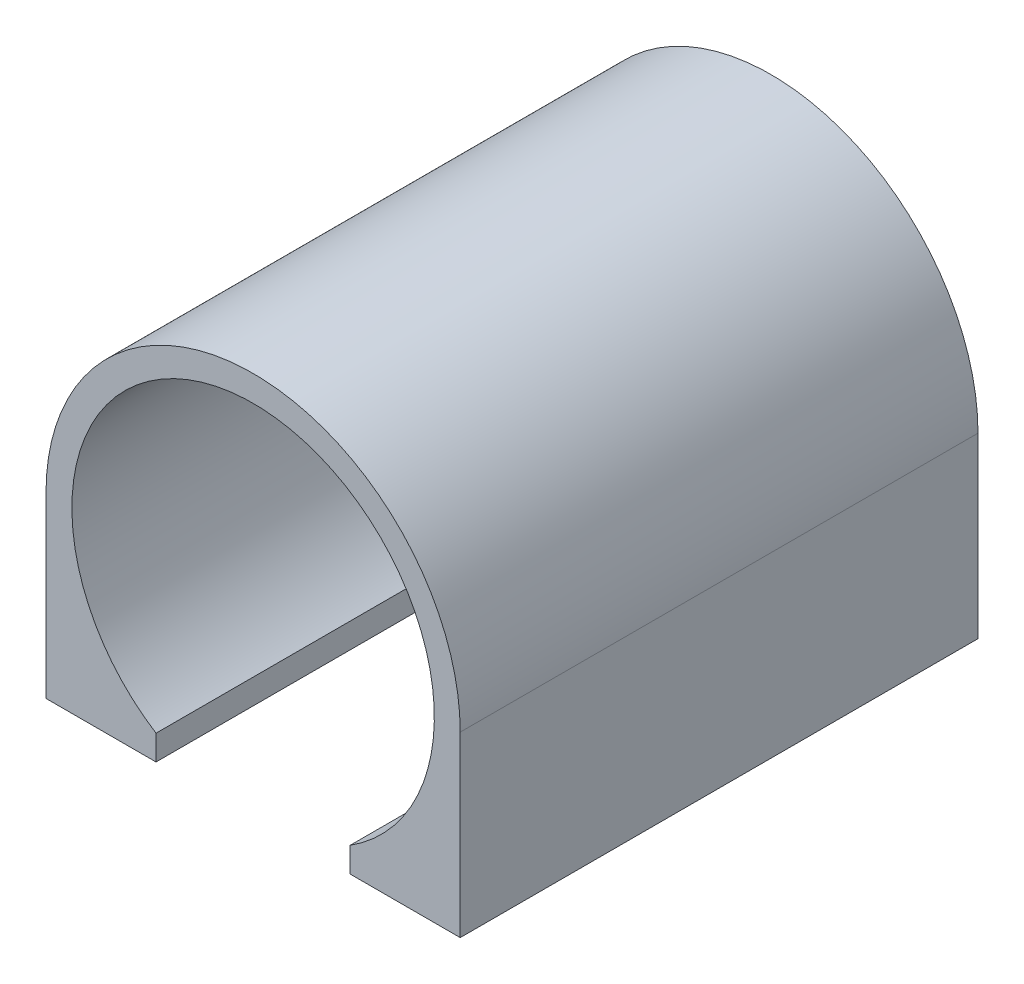
ISO-10303-21;
HEADER;
FILE_DESCRIPTION(('STEP AP214'),'2;1');
FILE_NAME('part.step','',(''),(''),'','','');
FILE_SCHEMA(('AUTOMOTIVE_DESIGN { 1 0 10303 214 1 1 1 1 }'));
ENDSEC;
DATA;
#1=APPLICATION_CONTEXT('core data for automotive mechanical design processes');
#2=APPLICATION_PROTOCOL_DEFINITION('international standard','automotive_design',2000,#1);
#3=PRODUCT_CONTEXT('',#1,'mechanical');
#4=PRODUCT('Part','Part','',(#3));
#5=PRODUCT_RELATED_PRODUCT_CATEGORY('part','',(#4));
#6=PRODUCT_DEFINITION_FORMATION('','',#4);
#7=PRODUCT_DEFINITION_CONTEXT('part definition',#1,'design');
#8=PRODUCT_DEFINITION('design','',#6,#7);
#9=PRODUCT_DEFINITION_SHAPE('','',#8);
#10=(LENGTH_UNIT() NAMED_UNIT(*) SI_UNIT(.MILLI.,.METRE.));
#11=(NAMED_UNIT(*) PLANE_ANGLE_UNIT() SI_UNIT($,.RADIAN.));
#12=(NAMED_UNIT(*) SI_UNIT($,.STERADIAN.) SOLID_ANGLE_UNIT());
#13=UNCERTAINTY_MEASURE_WITH_UNIT(LENGTH_MEASURE(1.E-05),#10,'distance_accuracy_value','');
#14=(GEOMETRIC_REPRESENTATION_CONTEXT(3) GLOBAL_UNCERTAINTY_ASSIGNED_CONTEXT((#13)) GLOBAL_UNIT_ASSIGNED_CONTEXT((#10,
#11,#12)) REPRESENTATION_CONTEXT('',''));
#15=CARTESIAN_POINT('',(0.,0.,0.));
#16=DIRECTION('',(0.,0.,1.));
#17=DIRECTION('',(1.,0.,0.));
#18=AXIS2_PLACEMENT_3D('',#15,#16,#17);
#19=CARTESIAN_POINT('',(0.,-13.75,40.));
#20=DIRECTION('',(0.,-1.,0.));
#21=DIRECTION('',(1.,0.,0.));
#22=AXIS2_PLACEMENT_3D('',#19,#20,#21);
#23=PLANE('',#22);
#24=CARTESIAN_POINT('',(-13.,-13.75,33.3333333333333));
#25=DIRECTION('',(0.,-1.,0.));
#26=DIRECTION('',(-1.,0.,0.));
#27=AXIS2_PLACEMENT_3D('',#24,#25,#26);
#28=CIRCLE('',#27,1.5);
#29=CARTESIAN_POINT('',(-14.5,-13.75,33.3333333333333));
#30=VERTEX_POINT('',#29);
#31=EDGE_CURVE('E220',#30,#30,#28,.T.);
#32=ORIENTED_EDGE('',*,*,#31,.F.);
#33=EDGE_LOOP('',(#32));
#34=FACE_BOUND('',#33,.T.);
#35=CARTESIAN_POINT('',(-13.,-13.75,20.));
#36=DIRECTION('',(0.,-1.,0.));
#37=DIRECTION('',(-1.,0.,0.));
#38=AXIS2_PLACEMENT_3D('',#35,#36,#37);
#39=CIRCLE('',#38,1.5);
#40=CARTESIAN_POINT('',(-14.5,-13.75,20.));
#41=VERTEX_POINT('',#40);
#42=EDGE_CURVE('E211',#41,#41,#39,.T.);
#43=ORIENTED_EDGE('',*,*,#42,.F.);
#44=EDGE_LOOP('',(#43));
#45=FACE_BOUND('',#44,.T.);
#46=CARTESIAN_POINT('',(-13.,-13.75,6.66666666666667));
#47=DIRECTION('',(0.,-1.,0.));
#48=DIRECTION('',(-1.,0.,0.));
#49=AXIS2_PLACEMENT_3D('',#46,#47,#48);
#50=CIRCLE('',#49,1.5);
#51=CARTESIAN_POINT('',(-14.5,-13.75,6.66666666666667));
#52=VERTEX_POINT('',#51);
#53=EDGE_CURVE('E202',#52,#52,#50,.T.);
#54=ORIENTED_EDGE('',*,*,#53,.F.);
#55=EDGE_LOOP('',(#54));
#56=FACE_BOUND('',#55,.T.);
#57=DIRECTION('',(-1.,0.,0.));
#58=VECTOR('',#57,1.);
#59=CARTESIAN_POINT('',(0.,-13.75,0.));
#60=LINE('',#59,#58);
#61=CARTESIAN_POINT('',(-7.5,-13.75,0.));
#62=VERTEX_POINT('',#61);
#63=CARTESIAN_POINT('',(-16.,-13.75,0.));
#64=VERTEX_POINT('',#63);
#65=EDGE_CURVE('E131',#62,#64,#60,.T.);
#66=ORIENTED_EDGE('',*,*,#65,.F.);
#67=DIRECTION('',(0.,0.,1.));
#68=VECTOR('',#67,1.);
#69=CARTESIAN_POINT('',(-7.5,-13.75,0.));
#70=LINE('',#69,#68);
#71=CARTESIAN_POINT('',(-7.5,-13.75,40.));
#72=VERTEX_POINT('',#71);
#73=EDGE_CURVE('E60',#62,#72,#70,.T.);
#74=ORIENTED_EDGE('',*,*,#73,.T.);
#75=DIRECTION('',(-1.,0.,0.));
#76=VECTOR('',#75,1.);
#77=CARTESIAN_POINT('',(0.,-13.75,40.));
#78=LINE('',#77,#76);
#79=CARTESIAN_POINT('',(-16.,-13.75,40.));
#80=VERTEX_POINT('',#79);
#81=EDGE_CURVE('E164',#72,#80,#78,.T.);
#82=ORIENTED_EDGE('',*,*,#81,.T.);
#83=DIRECTION('',(0.,0.,-1.));
#84=VECTOR('',#83,1.);
#85=CARTESIAN_POINT('',(-16.,-13.75,40.));
#86=LINE('',#85,#84);
#87=EDGE_CURVE('E140',#80,#64,#86,.T.);
#88=ORIENTED_EDGE('',*,*,#87,.T.);
#89=EDGE_LOOP('',(#66,#74,#82,#88));
#90=FACE_BOUND('',#89,.T.);
#91=ADVANCED_FACE('F45',(#34,#45,#56,#90),#23,.T.);
#92=CARTESIAN_POINT('',(0.,0.,40.));
#93=DIRECTION('',(0.,0.,-1.));
#94=DIRECTION('',(-1.,0.,0.));
#95=AXIS2_PLACEMENT_3D('',#92,#93,#94);
#96=CYLINDRICAL_SURFACE('',#95,14.);
#97=CARTESIAN_POINT('',(0.,0.,40.));
#98=DIRECTION('',(0.,0.,1.));
#99=DIRECTION('',(1.,0.,0.));
#100=AXIS2_PLACEMENT_3D('',#97,#98,#99);
#101=CIRCLE('',#100,14.);
#102=CARTESIAN_POINT('',(7.5,-11.8215904175369,40.));
#103=VERTEX_POINT('',#102);
#104=CARTESIAN_POINT('',(-7.5,-11.8215904175369,40.));
#105=VERTEX_POINT('',#104);
#106=EDGE_CURVE('E172',#103,#105,#101,.T.);
#107=ORIENTED_EDGE('',*,*,#106,.T.);
#108=DIRECTION('',(0.,0.,-1.));
#109=VECTOR('',#108,1.);
#110=CARTESIAN_POINT('',(-7.5,-11.8215904175369,40.));
#111=LINE('',#110,#109);
#112=CARTESIAN_POINT('',(-7.5,-11.8215904175369,0.));
#113=VERTEX_POINT('',#112);
#114=EDGE_CURVE('E189',#105,#113,#111,.T.);
#115=ORIENTED_EDGE('',*,*,#114,.T.);
#116=CARTESIAN_POINT('',(0.,0.,0.));
#117=DIRECTION('',(0.,0.,1.));
#118=DIRECTION('',(1.,0.,0.));
#119=AXIS2_PLACEMENT_3D('',#116,#117,#118);
#120=CIRCLE('',#119,14.);
#121=CARTESIAN_POINT('',(7.5,-11.8215904175369,0.));
#122=VERTEX_POINT('',#121);
#123=EDGE_CURVE('E127',#122,#113,#120,.T.);
#124=ORIENTED_EDGE('',*,*,#123,.F.);
#125=DIRECTION('',(0.,0.,-1.));
#126=VECTOR('',#125,1.);
#127=CARTESIAN_POINT('',(7.5,-11.8215904175369,40.));
#128=LINE('',#127,#126);
#129=EDGE_CURVE('E63',#122,#103,#128,.F.);
#130=ORIENTED_EDGE('',*,*,#129,.T.);
#131=EDGE_LOOP('',(#107,#115,#124,#130));
#132=FACE_BOUND('',#131,.T.);
#133=ADVANCED_FACE('F228',(#132),#96,.F.);
#134=CARTESIAN_POINT('',(0.,-13.75,40.));
#135=DIRECTION('',(0.,1.,0.));
#136=DIRECTION('',(-1.,0.,0.));
#137=AXIS2_PLACEMENT_3D('',#134,#135,#136);
#138=PLANE('',#137);
#139=CARTESIAN_POINT('',(13.,-13.75,33.3333333333333));
#140=DIRECTION('',(0.,-1.,0.));
#141=DIRECTION('',(1.,0.,0.));
#142=AXIS2_PLACEMENT_3D('',#139,#140,#141);
#143=CIRCLE('',#142,1.5);
#144=CARTESIAN_POINT('',(14.5,-13.75,33.3333333333333));
#145=VERTEX_POINT('',#144);
#146=EDGE_CURVE('E156',#145,#145,#143,.T.);
#147=ORIENTED_EDGE('',*,*,#146,.F.);
#148=EDGE_LOOP('',(#147));
#149=FACE_BOUND('',#148,.T.);
#150=CARTESIAN_POINT('',(13.,-13.75,20.));
#151=DIRECTION('',(0.,-1.,0.));
#152=DIRECTION('',(1.,0.,0.));
#153=AXIS2_PLACEMENT_3D('',#150,#151,#152);
#154=CIRCLE('',#153,1.5);
#155=CARTESIAN_POINT('',(14.5,-13.75,20.));
#156=VERTEX_POINT('',#155);
#157=EDGE_CURVE('E194',#156,#156,#154,.T.);
#158=ORIENTED_EDGE('',*,*,#157,.F.);
#159=EDGE_LOOP('',(#158));
#160=FACE_BOUND('',#159,.T.);
#161=CARTESIAN_POINT('',(13.,-13.75,6.66666666666667));
#162=DIRECTION('',(0.,-1.,0.));
#163=DIRECTION('',(1.,0.,0.));
#164=AXIS2_PLACEMENT_3D('',#161,#162,#163);
#165=CIRCLE('',#164,1.5);
#166=CARTESIAN_POINT('',(14.5,-13.75,6.66666666666667));
#167=VERTEX_POINT('',#166);
#168=EDGE_CURVE('E200',#167,#167,#165,.T.);
#169=ORIENTED_EDGE('',*,*,#168,.F.);
#170=EDGE_LOOP('',(#169));
#171=FACE_BOUND('',#170,.T.);
#172=DIRECTION('',(0.,0.,1.));
#173=VECTOR('',#172,1.);
#174=CARTESIAN_POINT('',(7.5,-13.75,0.));
#175=LINE('',#174,#173);
#176=CARTESIAN_POINT('',(7.5,-13.75,0.));
#177=VERTEX_POINT('',#176);
#178=CARTESIAN_POINT('',(7.5,-13.75,40.));
#179=VERTEX_POINT('',#178);
#180=EDGE_CURVE('E104',#177,#179,#175,.T.);
#181=ORIENTED_EDGE('',*,*,#180,.F.);
#182=DIRECTION('',(1.,0.,0.));
#183=VECTOR('',#182,1.);
#184=CARTESIAN_POINT('',(0.,-13.75,0.));
#185=LINE('',#184,#183);
#186=CARTESIAN_POINT('',(16.,-13.75,0.));
#187=VERTEX_POINT('',#186);
#188=EDGE_CURVE('E113',#177,#187,#185,.T.);
#189=ORIENTED_EDGE('',*,*,#188,.T.);
#190=DIRECTION('',(0.,0.,-1.));
#191=VECTOR('',#190,1.);
#192=CARTESIAN_POINT('',(16.,-13.75,40.));
#193=LINE('',#192,#191);
#194=CARTESIAN_POINT('',(16.,-13.75,40.));
#195=VERTEX_POINT('',#194);
#196=EDGE_CURVE('E134',#195,#187,#193,.T.);
#197=ORIENTED_EDGE('',*,*,#196,.F.);
#198=DIRECTION('',(1.,0.,0.));
#199=VECTOR('',#198,1.);
#200=CARTESIAN_POINT('',(0.,-13.75,40.));
#201=LINE('',#200,#199);
#202=EDGE_CURVE('E120',#179,#195,#201,.T.);
#203=ORIENTED_EDGE('',*,*,#202,.F.);
#204=EDGE_LOOP('',(#181,#189,#197,#203));
#205=FACE_BOUND('',#204,.T.);
#206=ADVANCED_FACE('F114',(#149,#160,#171,#205),#138,.F.);
#207=CARTESIAN_POINT('',(0.,0.,40.));
#208=DIRECTION('',(0.,0.,1.));
#209=DIRECTION('',(1.,0.,0.));
#210=AXIS2_PLACEMENT_3D('',#207,#208,#209);
#211=PLANE('',#210);
#212=ORIENTED_EDGE('',*,*,#81,.F.);
#213=DIRECTION('',(0.,1.,0.));
#214=VECTOR('',#213,1.);
#215=CARTESIAN_POINT('',(-7.5,-13.75,40.));
#216=LINE('',#215,#214);
#217=EDGE_CURVE('E181',#72,#105,#216,.T.);
#218=ORIENTED_EDGE('',*,*,#217,.T.);
#219=ORIENTED_EDGE('',*,*,#106,.F.);
#220=DIRECTION('',(0.,-1.,0.));
#221=VECTOR('',#220,1.);
#222=CARTESIAN_POINT('',(7.5,-3.75,40.));
#223=LINE('',#222,#221);
#224=EDGE_CURVE('E182',#103,#179,#223,.T.);
#225=ORIENTED_EDGE('',*,*,#224,.T.);
#226=ORIENTED_EDGE('',*,*,#202,.T.);
#227=DIRECTION('',(0.,-1.,0.));
#228=VECTOR('',#227,1.);
#229=CARTESIAN_POINT('',(16.,0.,40.));
#230=LINE('',#229,#228);
#231=CARTESIAN_POINT('',(16.,0.,40.));
#232=VERTEX_POINT('',#231);
#233=EDGE_CURVE('E123',#232,#195,#230,.T.);
#234=ORIENTED_EDGE('',*,*,#233,.F.);
#235=CARTESIAN_POINT('',(0.,0.,40.));
#236=DIRECTION('',(0.,0.,1.));
#237=DIRECTION('',(1.,0.,0.));
#238=AXIS2_PLACEMENT_3D('',#235,#236,#237);
#239=CIRCLE('',#238,16.);
#240=CARTESIAN_POINT('',(-16.,0.,40.));
#241=VERTEX_POINT('',#240);
#242=EDGE_CURVE('E129',#232,#241,#239,.T.);
#243=ORIENTED_EDGE('',*,*,#242,.T.);
#244=DIRECTION('',(0.,-1.,0.));
#245=VECTOR('',#244,1.);
#246=CARTESIAN_POINT('',(-16.,0.,40.));
#247=LINE('',#246,#245);
#248=EDGE_CURVE('E168',#241,#80,#247,.T.);
#249=ORIENTED_EDGE('',*,*,#248,.T.);
#250=EDGE_LOOP('',(#212,#218,#219,#225,#226,#234,#243,#249));
#251=FACE_BOUND('',#250,.T.);
#252=ADVANCED_FACE('F178',(#251),#211,.T.);
#253=CARTESIAN_POINT('',(0.,0.,0.));
#254=DIRECTION('',(0.,0.,1.));
#255=DIRECTION('',(1.,0.,0.));
#256=AXIS2_PLACEMENT_3D('',#253,#254,#255);
#257=PLANE('',#256);
#258=DIRECTION('',(0.,1.,0.));
#259=VECTOR('',#258,1.);
#260=CARTESIAN_POINT('',(-7.5,-13.75,0.));
#261=LINE('',#260,#259);
#262=EDGE_CURVE('E117',#62,#113,#261,.T.);
#263=ORIENTED_EDGE('',*,*,#262,.F.);
#264=ORIENTED_EDGE('',*,*,#65,.T.);
#265=DIRECTION('',(0.,-1.,0.));
#266=VECTOR('',#265,1.);
#267=CARTESIAN_POINT('',(-16.,0.,0.));
#268=LINE('',#267,#266);
#269=CARTESIAN_POINT('',(-16.,0.,0.));
#270=VERTEX_POINT('',#269);
#271=EDGE_CURVE('E151',#270,#64,#268,.T.);
#272=ORIENTED_EDGE('',*,*,#271,.F.);
#273=CARTESIAN_POINT('',(0.,0.,0.));
#274=DIRECTION('',(0.,0.,1.));
#275=DIRECTION('',(1.,0.,0.));
#276=AXIS2_PLACEMENT_3D('',#273,#274,#275);
#277=CIRCLE('',#276,16.);
#278=CARTESIAN_POINT('',(16.,0.,0.));
#279=VERTEX_POINT('',#278);
#280=EDGE_CURVE('E148',#279,#270,#277,.T.);
#281=ORIENTED_EDGE('',*,*,#280,.F.);
#282=DIRECTION('',(0.,-1.,0.));
#283=VECTOR('',#282,1.);
#284=CARTESIAN_POINT('',(16.,0.,0.));
#285=LINE('',#284,#283);
#286=EDGE_CURVE('E121',#279,#187,#285,.T.);
#287=ORIENTED_EDGE('',*,*,#286,.T.);
#288=ORIENTED_EDGE('',*,*,#188,.F.);
#289=DIRECTION('',(0.,-1.,0.));
#290=VECTOR('',#289,1.);
#291=CARTESIAN_POINT('',(7.5,0.,0.));
#292=LINE('',#291,#290);
#293=EDGE_CURVE('E11',#122,#177,#292,.T.);
#294=ORIENTED_EDGE('',*,*,#293,.F.);
#295=ORIENTED_EDGE('',*,*,#123,.T.);
#296=EDGE_LOOP('',(#263,#264,#272,#281,#287,#288,#294,#295));
#297=FACE_BOUND('',#296,.T.);
#298=ADVANCED_FACE('F122',(#297),#257,.F.);
#299=CARTESIAN_POINT('',(16.,0.,40.));
#300=DIRECTION('',(1.,0.,0.));
#301=DIRECTION('',(0.,0.,-1.));
#302=AXIS2_PLACEMENT_3D('',#299,#300,#301);
#303=PLANE('',#302);
#304=ORIENTED_EDGE('',*,*,#286,.F.);
#305=DIRECTION('',(0.,0.,-1.));
#306=VECTOR('',#305,1.);
#307=CARTESIAN_POINT('',(16.,0.,40.));
#308=LINE('',#307,#306);
#309=EDGE_CURVE('E49',#232,#279,#308,.T.);
#310=ORIENTED_EDGE('',*,*,#309,.F.);
#311=ORIENTED_EDGE('',*,*,#233,.T.);
#312=ORIENTED_EDGE('',*,*,#196,.T.);
#313=EDGE_LOOP('',(#304,#310,#311,#312));
#314=FACE_BOUND('',#313,.T.);
#315=ADVANCED_FACE('F42',(#314),#303,.T.);
#316=CARTESIAN_POINT('',(0.,0.,40.));
#317=DIRECTION('',(0.,0.,-1.));
#318=DIRECTION('',(-1.,0.,0.));
#319=AXIS2_PLACEMENT_3D('',#316,#317,#318);
#320=CYLINDRICAL_SURFACE('',#319,16.);
#321=ORIENTED_EDGE('',*,*,#280,.T.);
#322=DIRECTION('',(0.,0.,-1.));
#323=VECTOR('',#322,1.);
#324=CARTESIAN_POINT('',(-16.,0.,40.));
#325=LINE('',#324,#323);
#326=EDGE_CURVE('E138',#241,#270,#325,.T.);
#327=ORIENTED_EDGE('',*,*,#326,.F.);
#328=ORIENTED_EDGE('',*,*,#242,.F.);
#329=ORIENTED_EDGE('',*,*,#309,.T.);
#330=EDGE_LOOP('',(#321,#327,#328,#329));
#331=FACE_BOUND('',#330,.T.);
#332=ADVANCED_FACE('F145',(#331),#320,.T.);
#333=CARTESIAN_POINT('',(-16.,0.,40.));
#334=DIRECTION('',(1.,0.,0.));
#335=DIRECTION('',(0.,0.,-1.));
#336=AXIS2_PLACEMENT_3D('',#333,#334,#335);
#337=PLANE('',#336);
#338=ORIENTED_EDGE('',*,*,#271,.T.);
#339=ORIENTED_EDGE('',*,*,#87,.F.);
#340=ORIENTED_EDGE('',*,*,#248,.F.);
#341=ORIENTED_EDGE('',*,*,#326,.T.);
#342=EDGE_LOOP('',(#338,#339,#340,#341));
#343=FACE_BOUND('',#342,.T.);
#344=ADVANCED_FACE('F166',(#343),#337,.F.);
#345=CARTESIAN_POINT('',(13.,-10.75,33.3333333333333));
#346=DIRECTION('',(0.,-1.,0.));
#347=DIRECTION('',(1.,0.,0.));
#348=AXIS2_PLACEMENT_3D('',#345,#346,#347);
#349=CYLINDRICAL_SURFACE('',#348,1.5);
#350=CARTESIAN_POINT('',(13.,-10.75,33.3333333333333));
#351=DIRECTION('',(0.,-1.,0.));
#352=DIRECTION('',(1.,0.,0.));
#353=AXIS2_PLACEMENT_3D('',#350,#351,#352);
#354=CIRCLE('',#353,1.5);
#355=CARTESIAN_POINT('',(14.5,-10.75,33.3333333333333));
#356=VERTEX_POINT('',#355);
#357=EDGE_CURVE('E153',#356,#356,#354,.T.);
#358=ORIENTED_EDGE('',*,*,#357,.F.);
#359=EDGE_LOOP('',(#358));
#360=FACE_BOUND('',#359,.T.);
#361=ORIENTED_EDGE('',*,*,#146,.T.);
#362=EDGE_LOOP('',(#361));
#363=FACE_BOUND('',#362,.T.);
#364=ADVANCED_FACE('F223',(#360,#363),#349,.F.);
#365=CARTESIAN_POINT('',(13.,-10.75,33.3333333333333));
#366=DIRECTION('',(0.,-1.,0.));
#367=DIRECTION('',(1.,0.,0.));
#368=AXIS2_PLACEMENT_3D('',#365,#366,#367);
#369=PLANE('',#368);
#370=ORIENTED_EDGE('',*,*,#357,.T.);
#371=EDGE_LOOP('',(#370));
#372=FACE_BOUND('',#371,.T.);
#373=ADVANCED_FACE('F278',(#372),#369,.T.);
#374=CARTESIAN_POINT('',(13.,-10.75,20.));
#375=DIRECTION('',(0.,-1.,0.));
#376=DIRECTION('',(1.,0.,0.));
#377=AXIS2_PLACEMENT_3D('',#374,#375,#376);
#378=CYLINDRICAL_SURFACE('',#377,1.5);
#379=CARTESIAN_POINT('',(13.,-10.75,20.));
#380=DIRECTION('',(0.,-1.,0.));
#381=DIRECTION('',(1.,0.,0.));
#382=AXIS2_PLACEMENT_3D('',#379,#380,#381);
#383=CIRCLE('',#382,1.5);
#384=CARTESIAN_POINT('',(14.5,-10.75,20.));
#385=VERTEX_POINT('',#384);
#386=EDGE_CURVE('E198',#385,#385,#383,.T.);
#387=ORIENTED_EDGE('',*,*,#386,.F.);
#388=EDGE_LOOP('',(#387));
#389=FACE_BOUND('',#388,.T.);
#390=ORIENTED_EDGE('',*,*,#157,.T.);
#391=EDGE_LOOP('',(#390));
#392=FACE_BOUND('',#391,.T.);
#393=ADVANCED_FACE('F249',(#389,#392),#378,.F.);
#394=CARTESIAN_POINT('',(13.,-10.75,20.));
#395=DIRECTION('',(0.,-1.,0.));
#396=DIRECTION('',(1.,0.,0.));
#397=AXIS2_PLACEMENT_3D('',#394,#395,#396);
#398=PLANE('',#397);
#399=ORIENTED_EDGE('',*,*,#386,.T.);
#400=EDGE_LOOP('',(#399));
#401=FACE_BOUND('',#400,.T.);
#402=ADVANCED_FACE('F236',(#401),#398,.T.);
#403=CARTESIAN_POINT('',(13.,-10.75,6.66666666666667));
#404=DIRECTION('',(0.,-1.,0.));
#405=DIRECTION('',(1.,0.,0.));
#406=AXIS2_PLACEMENT_3D('',#403,#404,#405);
#407=CYLINDRICAL_SURFACE('',#406,1.5);
#408=CARTESIAN_POINT('',(13.,-10.75,6.66666666666667));
#409=DIRECTION('',(0.,-1.,0.));
#410=DIRECTION('',(1.,0.,0.));
#411=AXIS2_PLACEMENT_3D('',#408,#409,#410);
#412=CIRCLE('',#411,1.5);
#413=CARTESIAN_POINT('',(14.5,-10.75,6.66666666666667));
#414=VERTEX_POINT('',#413);
#415=EDGE_CURVE('E205',#414,#414,#412,.T.);
#416=ORIENTED_EDGE('',*,*,#415,.F.);
#417=EDGE_LOOP('',(#416));
#418=FACE_BOUND('',#417,.T.);
#419=ORIENTED_EDGE('',*,*,#168,.T.);
#420=EDGE_LOOP('',(#419));
#421=FACE_BOUND('',#420,.T.);
#422=ADVANCED_FACE('F233',(#418,#421),#407,.F.);
#423=CARTESIAN_POINT('',(13.,-10.75,6.66666666666667));
#424=DIRECTION('',(0.,-1.,0.));
#425=DIRECTION('',(1.,0.,0.));
#426=AXIS2_PLACEMENT_3D('',#423,#424,#425);
#427=PLANE('',#426);
#428=ORIENTED_EDGE('',*,*,#415,.T.);
#429=EDGE_LOOP('',(#428));
#430=FACE_BOUND('',#429,.T.);
#431=ADVANCED_FACE('F240',(#430),#427,.T.);
#432=CARTESIAN_POINT('',(-13.,-10.75,6.66666666666667));
#433=DIRECTION('',(0.,-1.,0.));
#434=DIRECTION('',(1.,0.,0.));
#435=AXIS2_PLACEMENT_3D('',#432,#433,#434);
#436=CYLINDRICAL_SURFACE('',#435,1.5);
#437=CARTESIAN_POINT('',(-13.,-10.75,6.66666666666667));
#438=DIRECTION('',(0.,-1.,0.));
#439=DIRECTION('',(-1.,0.,0.));
#440=AXIS2_PLACEMENT_3D('',#437,#438,#439);
#441=CIRCLE('',#440,1.5);
#442=CARTESIAN_POINT('',(-14.5,-10.75,6.66666666666667));
#443=VERTEX_POINT('',#442);
#444=EDGE_CURVE('E208',#443,#443,#441,.T.);
#445=ORIENTED_EDGE('',*,*,#444,.F.);
#446=EDGE_LOOP('',(#445));
#447=FACE_BOUND('',#446,.T.);
#448=ORIENTED_EDGE('',*,*,#53,.T.);
#449=EDGE_LOOP('',(#448));
#450=FACE_BOUND('',#449,.T.);
#451=ADVANCED_FACE('F244',(#447,#450),#436,.F.);
#452=CARTESIAN_POINT('',(-13.,-10.75,6.66666666666667));
#453=DIRECTION('',(0.,1.,0.));
#454=DIRECTION('',(-1.,0.,0.));
#455=AXIS2_PLACEMENT_3D('',#452,#453,#454);
#456=PLANE('',#455);
#457=ORIENTED_EDGE('',*,*,#444,.T.);
#458=EDGE_LOOP('',(#457));
#459=FACE_BOUND('',#458,.T.);
#460=ADVANCED_FACE('F298',(#459),#456,.F.);
#461=CARTESIAN_POINT('',(-13.,-10.75,20.));
#462=DIRECTION('',(0.,-1.,0.));
#463=DIRECTION('',(1.,0.,0.));
#464=AXIS2_PLACEMENT_3D('',#461,#462,#463);
#465=CYLINDRICAL_SURFACE('',#464,1.5);
#466=CARTESIAN_POINT('',(-13.,-10.75,20.));
#467=DIRECTION('',(0.,-1.,0.));
#468=DIRECTION('',(-1.,0.,0.));
#469=AXIS2_PLACEMENT_3D('',#466,#467,#468);
#470=CIRCLE('',#469,1.5);
#471=CARTESIAN_POINT('',(-14.5,-10.75,20.));
#472=VERTEX_POINT('',#471);
#473=EDGE_CURVE('E212',#472,#472,#470,.T.);
#474=ORIENTED_EDGE('',*,*,#473,.F.);
#475=EDGE_LOOP('',(#474));
#476=FACE_BOUND('',#475,.T.);
#477=ORIENTED_EDGE('',*,*,#42,.T.);
#478=EDGE_LOOP('',(#477));
#479=FACE_BOUND('',#478,.T.);
#480=ADVANCED_FACE('F293',(#476,#479),#465,.F.);
#481=CARTESIAN_POINT('',(-13.,-10.75,20.));
#482=DIRECTION('',(0.,1.,0.));
#483=DIRECTION('',(-1.,0.,0.));
#484=AXIS2_PLACEMENT_3D('',#481,#482,#483);
#485=PLANE('',#484);
#486=ORIENTED_EDGE('',*,*,#473,.T.);
#487=EDGE_LOOP('',(#486));
#488=FACE_BOUND('',#487,.T.);
#489=ADVANCED_FACE('F292',(#488),#485,.F.);
#490=CARTESIAN_POINT('',(-13.,-10.75,33.3333333333333));
#491=DIRECTION('',(0.,-1.,0.));
#492=DIRECTION('',(1.,0.,0.));
#493=AXIS2_PLACEMENT_3D('',#490,#491,#492);
#494=CYLINDRICAL_SURFACE('',#493,1.5);
#495=CARTESIAN_POINT('',(-13.,-10.75,33.3333333333333));
#496=DIRECTION('',(0.,-1.,0.));
#497=DIRECTION('',(-1.,0.,0.));
#498=AXIS2_PLACEMENT_3D('',#495,#496,#497);
#499=CIRCLE('',#498,1.5);
#500=CARTESIAN_POINT('',(-14.5,-10.75,33.3333333333333));
#501=VERTEX_POINT('',#500);
#502=EDGE_CURVE('E195',#501,#501,#499,.T.);
#503=ORIENTED_EDGE('',*,*,#502,.F.);
#504=EDGE_LOOP('',(#503));
#505=FACE_BOUND('',#504,.T.);
#506=ORIENTED_EDGE('',*,*,#31,.T.);
#507=EDGE_LOOP('',(#506));
#508=FACE_BOUND('',#507,.T.);
#509=ADVANCED_FACE('F290',(#505,#508),#494,.F.);
#510=CARTESIAN_POINT('',(-13.,-10.75,33.3333333333333));
#511=DIRECTION('',(0.,1.,0.));
#512=DIRECTION('',(-1.,0.,0.));
#513=AXIS2_PLACEMENT_3D('',#510,#511,#512);
#514=PLANE('',#513);
#515=ORIENTED_EDGE('',*,*,#502,.T.);
#516=EDGE_LOOP('',(#515));
#517=FACE_BOUND('',#516,.T.);
#518=ADVANCED_FACE('F284',(#517),#514,.F.);
#519=CARTESIAN_POINT('',(7.5,-3.75,0.));
#520=DIRECTION('',(-1.,0.,0.));
#521=DIRECTION('',(0.,-1.,0.));
#522=AXIS2_PLACEMENT_3D('',#519,#520,#521);
#523=PLANE('',#522);
#524=ORIENTED_EDGE('',*,*,#293,.T.);
#525=ORIENTED_EDGE('',*,*,#180,.T.);
#526=ORIENTED_EDGE('',*,*,#224,.F.);
#527=ORIENTED_EDGE('',*,*,#129,.F.);
#528=EDGE_LOOP('',(#524,#525,#526,#527));
#529=FACE_BOUND('',#528,.T.);
#530=ADVANCED_FACE('F102',(#529),#523,.T.);
#531=CARTESIAN_POINT('',(-7.5,-13.75,0.));
#532=DIRECTION('',(1.,0.,0.));
#533=DIRECTION('',(0.,1.,0.));
#534=AXIS2_PLACEMENT_3D('',#531,#532,#533);
#535=PLANE('',#534);
#536=ORIENTED_EDGE('',*,*,#217,.F.);
#537=ORIENTED_EDGE('',*,*,#73,.F.);
#538=ORIENTED_EDGE('',*,*,#262,.T.);
#539=ORIENTED_EDGE('',*,*,#114,.F.);
#540=EDGE_LOOP('',(#536,#537,#538,#539));
#541=FACE_BOUND('',#540,.T.);
#542=ADVANCED_FACE('F384',(#541),#535,.T.);
#543=CLOSED_SHELL('',(#91,#133,#206,#252,#298,#315,#332,#344,#364,#373,#393,#402,#422,#431,#451,
#460,#480,#489,#509,#518,#530,#542));
#544=MANIFOLD_SOLID_BREP('B2',#543);
#545=ADVANCED_BREP_SHAPE_REPRESENTATION('',(#18,#544),#14);
#546=SHAPE_DEFINITION_REPRESENTATION(#9,#545);
ENDSEC;
END-ISO-10303-21;
